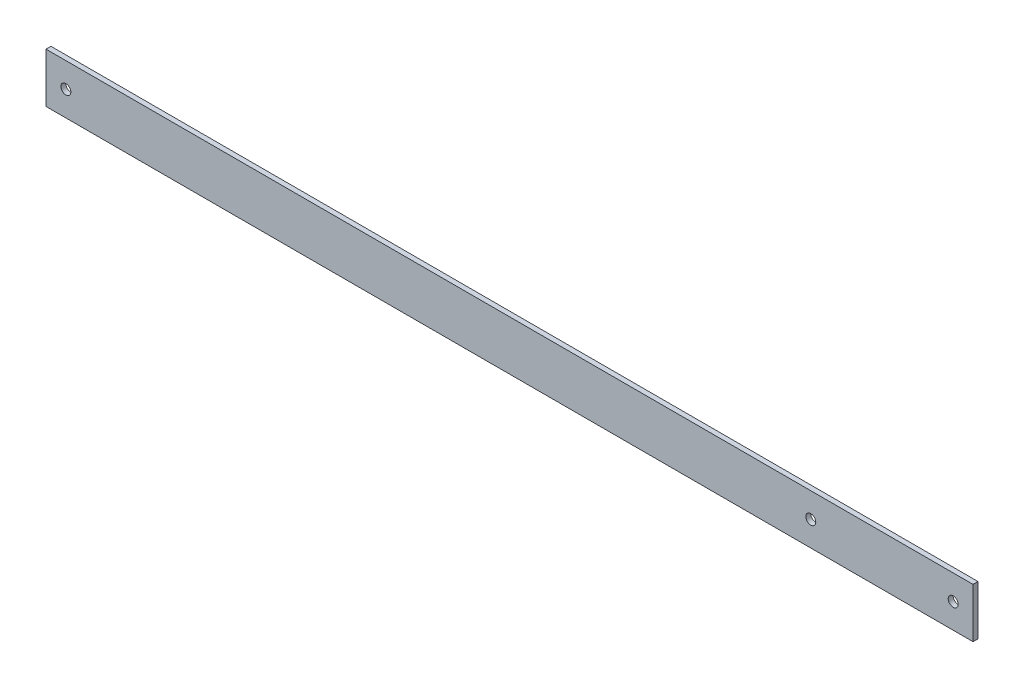
ISO-10303-21;
HEADER;
FILE_DESCRIPTION(('STEP AP214'),'2;1');
FILE_NAME('part.step','',(''),(''),'','','');
FILE_SCHEMA(('AUTOMOTIVE_DESIGN { 1 0 10303 214 1 1 1 1 }'));
ENDSEC;
DATA;
#1=APPLICATION_CONTEXT('core data for automotive mechanical design processes');
#2=APPLICATION_PROTOCOL_DEFINITION('international standard','automotive_design',2000,#1);
#3=PRODUCT_CONTEXT('',#1,'mechanical');
#4=PRODUCT('Part','Part','',(#3));
#5=PRODUCT_RELATED_PRODUCT_CATEGORY('part','',(#4));
#6=PRODUCT_DEFINITION_FORMATION('','',#4);
#7=PRODUCT_DEFINITION_CONTEXT('part definition',#1,'design');
#8=PRODUCT_DEFINITION('design','',#6,#7);
#9=PRODUCT_DEFINITION_SHAPE('','',#8);
#10=(LENGTH_UNIT() NAMED_UNIT(*) SI_UNIT(.MILLI.,.METRE.));
#11=(NAMED_UNIT(*) PLANE_ANGLE_UNIT() SI_UNIT($,.RADIAN.));
#12=(NAMED_UNIT(*) SI_UNIT($,.STERADIAN.) SOLID_ANGLE_UNIT());
#13=UNCERTAINTY_MEASURE_WITH_UNIT(LENGTH_MEASURE(1.E-05),#10,'distance_accuracy_value','');
#14=(GEOMETRIC_REPRESENTATION_CONTEXT(3) GLOBAL_UNCERTAINTY_ASSIGNED_CONTEXT((#13)) GLOBAL_UNIT_ASSIGNED_CONTEXT((#10,
#11,#12)) REPRESENTATION_CONTEXT('',''));
#15=CARTESIAN_POINT('',(0.,0.,0.));
#16=DIRECTION('',(0.,0.,1.));
#17=DIRECTION('',(1.,0.,0.));
#18=AXIS2_PLACEMENT_3D('',#15,#16,#17);
#19=CARTESIAN_POINT('',(-286.909577854999,1668.03196993675,1.5));
#20=DIRECTION('',(1.,0.,0.));
#21=DIRECTION('',(0.,0.,-1.));
#22=AXIS2_PLACEMENT_3D('',#19,#20,#21);
#23=PLANE('',#22);
#24=DIRECTION('',(0.,-1.,0.));
#25=VECTOR('',#24,1.);
#26=CARTESIAN_POINT('',(-286.909577854999,1668.03196993675,0.));
#27=LINE('',#26,#25);
#28=CARTESIAN_POINT('',(-286.909577854999,1683.03196993675,0.));
#29=VERTEX_POINT('',#28);
#30=CARTESIAN_POINT('',(-286.909577854999,1668.03196993675,0.));
#31=VERTEX_POINT('',#30);
#32=EDGE_CURVE('E94',#29,#31,#27,.T.);
#33=ORIENTED_EDGE('',*,*,#32,.T.);
#34=DIRECTION('',(0.,0.,-1.));
#35=VECTOR('',#34,1.);
#36=CARTESIAN_POINT('',(-286.909577854999,1668.03196993675,1.5));
#37=LINE('',#36,#35);
#38=CARTESIAN_POINT('',(-286.909577854999,1668.03196993675,1.5));
#39=VERTEX_POINT('',#38);
#40=EDGE_CURVE('E11',#39,#31,#37,.T.);
#41=ORIENTED_EDGE('',*,*,#40,.F.);
#42=DIRECTION('',(0.,-1.,0.));
#43=VECTOR('',#42,1.);
#44=CARTESIAN_POINT('',(-286.909577854999,1668.03196993675,1.5));
#45=LINE('',#44,#43);
#46=CARTESIAN_POINT('',(-286.909577854999,1683.03196993675,1.5));
#47=VERTEX_POINT('',#46);
#48=EDGE_CURVE('E82',#47,#39,#45,.T.);
#49=ORIENTED_EDGE('',*,*,#48,.F.);
#50=DIRECTION('',(0.,0.,-1.));
#51=VECTOR('',#50,1.);
#52=CARTESIAN_POINT('',(-286.909577854999,1683.03196993675,1.5));
#53=LINE('',#52,#51);
#54=EDGE_CURVE('E90',#47,#29,#53,.T.);
#55=ORIENTED_EDGE('',*,*,#54,.T.);
#56=EDGE_LOOP('',(#33,#41,#49,#55));
#57=FACE_BOUND('',#56,.T.);
#58=ADVANCED_FACE('F31',(#57),#23,.F.);
#59=CARTESIAN_POINT('',(-286.909577854999,1668.03196993675,1.5));
#60=DIRECTION('',(0.,1.,0.));
#61=DIRECTION('',(0.,0.,1.));
#62=AXIS2_PLACEMENT_3D('',#59,#60,#61);
#63=PLANE('',#62);
#64=DIRECTION('',(1.,0.,0.));
#65=VECTOR('',#64,1.);
#66=CARTESIAN_POINT('',(-286.909577854999,1668.03196993675,0.));
#67=LINE('',#66,#65);
#68=CARTESIAN_POINT('',(-6.90957785499902,1668.03196993675,0.));
#69=VERTEX_POINT('',#68);
#70=EDGE_CURVE('E86',#31,#69,#67,.T.);
#71=ORIENTED_EDGE('',*,*,#70,.T.);
#72=DIRECTION('',(0.,0.,-1.));
#73=VECTOR('',#72,1.);
#74=CARTESIAN_POINT('',(-6.90957785499902,1668.03196993675,1.5));
#75=LINE('',#74,#73);
#76=CARTESIAN_POINT('',(-6.90957785499902,1668.03196993675,1.5));
#77=VERTEX_POINT('',#76);
#78=EDGE_CURVE('E39',#77,#69,#75,.T.);
#79=ORIENTED_EDGE('',*,*,#78,.F.);
#80=DIRECTION('',(1.,0.,0.));
#81=VECTOR('',#80,1.);
#82=CARTESIAN_POINT('',(-286.909577854999,1668.03196993675,1.5));
#83=LINE('',#82,#81);
#84=EDGE_CURVE('E77',#39,#77,#83,.T.);
#85=ORIENTED_EDGE('',*,*,#84,.F.);
#86=ORIENTED_EDGE('',*,*,#40,.T.);
#87=EDGE_LOOP('',(#71,#79,#85,#86));
#88=FACE_BOUND('',#87,.T.);
#89=ADVANCED_FACE('F85',(#88),#63,.F.);
#90=CARTESIAN_POINT('',(-6.90957785499902,1668.03196993675,1.5));
#91=DIRECTION('',(-1.,0.,0.));
#92=DIRECTION('',(0.,0.,1.));
#93=AXIS2_PLACEMENT_3D('',#90,#91,#92);
#94=PLANE('',#93);
#95=DIRECTION('',(0.,1.,0.));
#96=VECTOR('',#95,1.);
#97=CARTESIAN_POINT('',(-6.90957785499902,1668.03196993675,0.));
#98=LINE('',#97,#96);
#99=CARTESIAN_POINT('',(-6.90957785499902,1683.03196993675,0.));
#100=VERTEX_POINT('',#99);
#101=EDGE_CURVE('E64',#69,#100,#98,.T.);
#102=ORIENTED_EDGE('',*,*,#101,.T.);
#103=DIRECTION('',(0.,0.,-1.));
#104=VECTOR('',#103,1.);
#105=CARTESIAN_POINT('',(-6.90957785499902,1683.03196993675,1.5));
#106=LINE('',#105,#104);
#107=CARTESIAN_POINT('',(-6.90957785499902,1683.03196993675,1.5));
#108=VERTEX_POINT('',#107);
#109=EDGE_CURVE('E87',#108,#100,#106,.T.);
#110=ORIENTED_EDGE('',*,*,#109,.F.);
#111=DIRECTION('',(0.,1.,0.));
#112=VECTOR('',#111,1.);
#113=CARTESIAN_POINT('',(-6.90957785499902,1668.03196993675,1.5));
#114=LINE('',#113,#112);
#115=EDGE_CURVE('E80',#77,#108,#114,.T.);
#116=ORIENTED_EDGE('',*,*,#115,.F.);
#117=ORIENTED_EDGE('',*,*,#78,.T.);
#118=EDGE_LOOP('',(#102,#110,#116,#117));
#119=FACE_BOUND('',#118,.T.);
#120=ADVANCED_FACE('F88',(#119),#94,.F.);
#121=CARTESIAN_POINT('',(-286.909577854999,1683.03196993675,1.5));
#122=DIRECTION('',(0.,-1.,0.));
#123=DIRECTION('',(0.,0.,-1.));
#124=AXIS2_PLACEMENT_3D('',#121,#122,#123);
#125=PLANE('',#124);
#126=DIRECTION('',(-1.,0.,0.));
#127=VECTOR('',#126,1.);
#128=CARTESIAN_POINT('',(-286.909577854999,1683.03196993675,0.));
#129=LINE('',#128,#127);
#130=EDGE_CURVE('E70',#100,#29,#129,.T.);
#131=ORIENTED_EDGE('',*,*,#130,.T.);
#132=ORIENTED_EDGE('',*,*,#54,.F.);
#133=DIRECTION('',(-1.,0.,0.));
#134=VECTOR('',#133,1.);
#135=CARTESIAN_POINT('',(-286.909577854999,1683.03196993675,1.5));
#136=LINE('',#135,#134);
#137=EDGE_CURVE('E47',#108,#47,#136,.T.);
#138=ORIENTED_EDGE('',*,*,#137,.F.);
#139=ORIENTED_EDGE('',*,*,#109,.T.);
#140=EDGE_LOOP('',(#131,#132,#138,#139));
#141=FACE_BOUND('',#140,.T.);
#142=ADVANCED_FACE('F102',(#141),#125,.F.);
#143=CARTESIAN_POINT('',(-286.909577854999,1683.03196993675,1.5));
#144=DIRECTION('',(0.,0.,-1.));
#145=DIRECTION('',(-1.,0.,0.));
#146=AXIS2_PLACEMENT_3D('',#143,#144,#145);
#147=PLANE('',#146);
#148=CARTESIAN_POINT('',(-55.909577854999,1675.53196993675,1.5));
#149=DIRECTION('',(0.,0.,-1.));
#150=DIRECTION('',(-1.,0.,0.));
#151=AXIS2_PLACEMENT_3D('',#148,#149,#150);
#152=CIRCLE('',#151,1.49999999999989);
#153=CARTESIAN_POINT('',(-57.4095778549989,1675.53196993675,1.5));
#154=VERTEX_POINT('',#153);
#155=EDGE_CURVE('E117',#154,#154,#152,.T.);
#156=ORIENTED_EDGE('',*,*,#155,.T.);
#157=EDGE_LOOP('',(#156));
#158=FACE_BOUND('',#157,.T.);
#159=CARTESIAN_POINT('',(-12.909577854999,1675.53196993675,1.5));
#160=DIRECTION('',(0.,0.,-1.));
#161=DIRECTION('',(-1.,0.,0.));
#162=AXIS2_PLACEMENT_3D('',#159,#160,#161);
#163=CIRCLE('',#162,1.49999999999972);
#164=CARTESIAN_POINT('',(-14.4095778549987,1675.53196993675,1.5));
#165=VERTEX_POINT('',#164);
#166=EDGE_CURVE('E111',#165,#165,#163,.T.);
#167=ORIENTED_EDGE('',*,*,#166,.T.);
#168=EDGE_LOOP('',(#167));
#169=FACE_BOUND('',#168,.T.);
#170=CARTESIAN_POINT('',(-280.909577854999,1675.53196993675,1.5));
#171=DIRECTION('',(0.,0.,-1.));
#172=DIRECTION('',(-1.,0.,0.));
#173=AXIS2_PLACEMENT_3D('',#170,#171,#172);
#174=CIRCLE('',#173,1.49999999999999);
#175=CARTESIAN_POINT('',(-282.409577854999,1675.53196993675,1.5));
#176=VERTEX_POINT('',#175);
#177=EDGE_CURVE('E97',#176,#176,#174,.T.);
#178=ORIENTED_EDGE('',*,*,#177,.T.);
#179=EDGE_LOOP('',(#178));
#180=FACE_BOUND('',#179,.T.);
#181=ORIENTED_EDGE('',*,*,#48,.T.);
#182=ORIENTED_EDGE('',*,*,#84,.T.);
#183=ORIENTED_EDGE('',*,*,#115,.T.);
#184=ORIENTED_EDGE('',*,*,#137,.T.);
#185=EDGE_LOOP('',(#181,#182,#183,#184));
#186=FACE_BOUND('',#185,.T.);
#187=ADVANCED_FACE('F78',(#158,#169,#180,#186),#147,.F.);
#188=CARTESIAN_POINT('',(-286.909577854999,1683.03196993675,0.));
#189=DIRECTION('',(0.,0.,-1.));
#190=DIRECTION('',(-1.,0.,0.));
#191=AXIS2_PLACEMENT_3D('',#188,#189,#190);
#192=PLANE('',#191);
#193=CARTESIAN_POINT('',(-55.909577854999,1675.53196993675,0.));
#194=DIRECTION('',(0.,0.,-1.));
#195=DIRECTION('',(-1.,0.,0.));
#196=AXIS2_PLACEMENT_3D('',#193,#194,#195);
#197=CIRCLE('',#196,1.49999999999989);
#198=CARTESIAN_POINT('',(-57.4095778549989,1675.53196993675,0.));
#199=VERTEX_POINT('',#198);
#200=EDGE_CURVE('E120',#199,#199,#197,.T.);
#201=ORIENTED_EDGE('',*,*,#200,.F.);
#202=EDGE_LOOP('',(#201));
#203=FACE_BOUND('',#202,.T.);
#204=CARTESIAN_POINT('',(-12.909577854999,1675.53196993675,0.));
#205=DIRECTION('',(0.,0.,-1.));
#206=DIRECTION('',(-1.,0.,0.));
#207=AXIS2_PLACEMENT_3D('',#204,#205,#206);
#208=CIRCLE('',#207,1.49999999999972);
#209=CARTESIAN_POINT('',(-14.4095778549987,1675.53196993675,0.));
#210=VERTEX_POINT('',#209);
#211=EDGE_CURVE('E114',#210,#210,#208,.T.);
#212=ORIENTED_EDGE('',*,*,#211,.F.);
#213=EDGE_LOOP('',(#212));
#214=FACE_BOUND('',#213,.T.);
#215=CARTESIAN_POINT('',(-280.909577854999,1675.53196993675,0.));
#216=DIRECTION('',(0.,0.,-1.));
#217=DIRECTION('',(-1.,0.,0.));
#218=AXIS2_PLACEMENT_3D('',#215,#216,#217);
#219=CIRCLE('',#218,1.49999999999999);
#220=CARTESIAN_POINT('',(-282.409577854999,1675.53196993675,0.));
#221=VERTEX_POINT('',#220);
#222=EDGE_CURVE('E108',#221,#221,#219,.T.);
#223=ORIENTED_EDGE('',*,*,#222,.F.);
#224=EDGE_LOOP('',(#223));
#225=FACE_BOUND('',#224,.T.);
#226=ORIENTED_EDGE('',*,*,#32,.F.);
#227=ORIENTED_EDGE('',*,*,#130,.F.);
#228=ORIENTED_EDGE('',*,*,#101,.F.);
#229=ORIENTED_EDGE('',*,*,#70,.F.);
#230=EDGE_LOOP('',(#226,#227,#228,#229));
#231=FACE_BOUND('',#230,.T.);
#232=ADVANCED_FACE('F105',(#203,#214,#225,#231),#192,.T.);
#233=CARTESIAN_POINT('',(-280.909577854999,1675.53196993675,1.5));
#234=DIRECTION('',(0.,0.,-1.));
#235=DIRECTION('',(-1.,0.,0.));
#236=AXIS2_PLACEMENT_3D('',#233,#234,#235);
#237=CYLINDRICAL_SURFACE('',#236,1.49999999999999);
#238=ORIENTED_EDGE('',*,*,#177,.F.);
#239=EDGE_LOOP('',(#238));
#240=FACE_BOUND('',#239,.T.);
#241=ORIENTED_EDGE('',*,*,#222,.T.);
#242=EDGE_LOOP('',(#241));
#243=FACE_BOUND('',#242,.T.);
#244=ADVANCED_FACE('F137',(#240,#243),#237,.F.);
#245=CARTESIAN_POINT('',(-12.909577854999,1675.53196993675,1.5));
#246=DIRECTION('',(0.,0.,-1.));
#247=DIRECTION('',(-1.,0.,0.));
#248=AXIS2_PLACEMENT_3D('',#245,#246,#247);
#249=CYLINDRICAL_SURFACE('',#248,1.49999999999972);
#250=ORIENTED_EDGE('',*,*,#166,.F.);
#251=EDGE_LOOP('',(#250));
#252=FACE_BOUND('',#251,.T.);
#253=ORIENTED_EDGE('',*,*,#211,.T.);
#254=EDGE_LOOP('',(#253));
#255=FACE_BOUND('',#254,.T.);
#256=ADVANCED_FACE('F131',(#252,#255),#249,.F.);
#257=CARTESIAN_POINT('',(-55.909577854999,1675.53196993675,1.5));
#258=DIRECTION('',(0.,0.,-1.));
#259=DIRECTION('',(-1.,0.,0.));
#260=AXIS2_PLACEMENT_3D('',#257,#258,#259);
#261=CYLINDRICAL_SURFACE('',#260,1.49999999999989);
#262=ORIENTED_EDGE('',*,*,#155,.F.);
#263=EDGE_LOOP('',(#262));
#264=FACE_BOUND('',#263,.T.);
#265=ORIENTED_EDGE('',*,*,#200,.T.);
#266=EDGE_LOOP('',(#265));
#267=FACE_BOUND('',#266,.T.);
#268=ADVANCED_FACE('F128',(#264,#267),#261,.F.);
#269=CLOSED_SHELL('',(#58,#89,#120,#142,#187,#232,#244,#256,#268));
#270=MANIFOLD_SOLID_BREP('B2',#269);
#271=ADVANCED_BREP_SHAPE_REPRESENTATION('',(#18,#270),#14);
#272=SHAPE_DEFINITION_REPRESENTATION(#9,#271);
ENDSEC;
END-ISO-10303-21;
